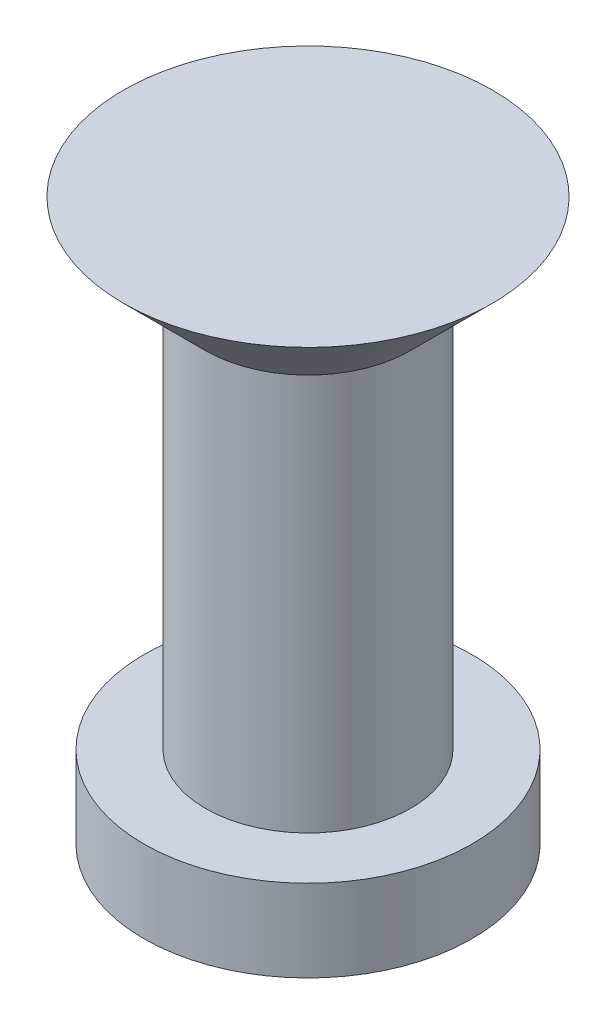
ISO-10303-21;
HEADER;
FILE_DESCRIPTION(('STEP AP214'),'2;1');
FILE_NAME('part.step','',(''),(''),'','','');
FILE_SCHEMA(('AUTOMOTIVE_DESIGN { 1 0 10303 214 1 1 1 1 }'));
ENDSEC;
DATA;
#1=APPLICATION_CONTEXT('core data for automotive mechanical design processes');
#2=APPLICATION_PROTOCOL_DEFINITION('international standard','automotive_design',2000,#1);
#3=PRODUCT_CONTEXT('',#1,'mechanical');
#4=PRODUCT('Part','Part','',(#3));
#5=PRODUCT_RELATED_PRODUCT_CATEGORY('part','',(#4));
#6=PRODUCT_DEFINITION_FORMATION('','',#4);
#7=PRODUCT_DEFINITION_CONTEXT('part definition',#1,'design');
#8=PRODUCT_DEFINITION('design','',#6,#7);
#9=PRODUCT_DEFINITION_SHAPE('','',#8);
#10=(LENGTH_UNIT() NAMED_UNIT(*) SI_UNIT(.MILLI.,.METRE.));
#11=(NAMED_UNIT(*) PLANE_ANGLE_UNIT() SI_UNIT($,.RADIAN.));
#12=(NAMED_UNIT(*) SI_UNIT($,.STERADIAN.) SOLID_ANGLE_UNIT());
#13=UNCERTAINTY_MEASURE_WITH_UNIT(LENGTH_MEASURE(1.E-05),#10,'distance_accuracy_value','');
#14=(GEOMETRIC_REPRESENTATION_CONTEXT(3) GLOBAL_UNCERTAINTY_ASSIGNED_CONTEXT((#13)) GLOBAL_UNIT_ASSIGNED_CONTEXT((#10,
#11,#12)) REPRESENTATION_CONTEXT('',''));
#15=CARTESIAN_POINT('',(0.,0.,0.));
#16=DIRECTION('',(0.,0.,1.));
#17=DIRECTION('',(1.,0.,0.));
#18=AXIS2_PLACEMENT_3D('',#15,#16,#17);
#19=CARTESIAN_POINT('',(0.,8.2,0.));
#20=DIRECTION('',(0.,-1.,0.));
#21=DIRECTION('',(0.,0.,-1.));
#22=AXIS2_PLACEMENT_3D('',#19,#20,#21);
#23=PLANE('',#22);
#24=CARTESIAN_POINT('',(0.,8.2,0.));
#25=DIRECTION('',(0.,1.,0.));
#26=DIRECTION('',(0.,0.,1.));
#27=AXIS2_PLACEMENT_3D('',#24,#25,#26);
#28=CIRCLE('',#27,2.70000000000001);
#29=CARTESIAN_POINT('',(0.,8.2,2.70000000000001));
#30=VERTEX_POINT('',#29);
#31=EDGE_CURVE('E10',#30,#30,#28,.T.);
#32=ORIENTED_EDGE('',*,*,#31,.T.);
#33=EDGE_LOOP('',(#32));
#34=FACE_BOUND('',#33,.T.);
#35=ADVANCED_FACE('F32',(#34),#23,.F.);
#36=CARTESIAN_POINT('',(0.,7.,0.));
#37=DIRECTION('',(0.,1.,0.));
#38=DIRECTION('',(0.,0.,1.));
#39=AXIS2_PLACEMENT_3D('',#36,#37,#38);
#40=CONICAL_SURFACE('',#39,1.5,0.78539816339745);
#41=ORIENTED_EDGE('',*,*,#31,.F.);
#42=EDGE_LOOP('',(#41));
#43=FACE_BOUND('',#42,.T.);
#44=CARTESIAN_POINT('',(0.,7.,0.));
#45=DIRECTION('',(0.,1.,0.));
#46=DIRECTION('',(0.,0.,1.));
#47=AXIS2_PLACEMENT_3D('',#44,#45,#46);
#48=CIRCLE('',#47,1.5);
#49=CARTESIAN_POINT('',(0.,7.,1.5));
#50=VERTEX_POINT('',#49);
#51=EDGE_CURVE('E38',#50,#50,#48,.T.);
#52=ORIENTED_EDGE('',*,*,#51,.T.);
#53=EDGE_LOOP('',(#52));
#54=FACE_BOUND('',#53,.T.);
#55=ADVANCED_FACE('F67',(#43,#54),#40,.T.);
#56=CARTESIAN_POINT('',(0.,26.718072965347,0.));
#57=DIRECTION('',(0.,1.,0.));
#58=DIRECTION('',(0.,0.,1.));
#59=AXIS2_PLACEMENT_3D('',#56,#57,#58);
#60=CYLINDRICAL_SURFACE('',#59,1.5);
#61=ORIENTED_EDGE('',*,*,#51,.F.);
#62=EDGE_LOOP('',(#61));
#63=FACE_BOUND('',#62,.T.);
#64=CARTESIAN_POINT('',(0.,1.2,0.));
#65=DIRECTION('',(0.,1.,0.));
#66=DIRECTION('',(0.,0.,1.));
#67=AXIS2_PLACEMENT_3D('',#64,#65,#66);
#68=CIRCLE('',#67,1.5);
#69=CARTESIAN_POINT('',(0.,1.2,1.5));
#70=VERTEX_POINT('',#69);
#71=EDGE_CURVE('E42',#70,#70,#68,.T.);
#72=ORIENTED_EDGE('',*,*,#71,.T.);
#73=EDGE_LOOP('',(#72));
#74=FACE_BOUND('',#73,.T.);
#75=ADVANCED_FACE('F71',(#63,#74),#60,.T.);
#76=CARTESIAN_POINT('',(1.5,1.2,0.));
#77=DIRECTION('',(0.,-1.,0.));
#78=DIRECTION('',(0.,0.,-1.));
#79=AXIS2_PLACEMENT_3D('',#76,#77,#78);
#80=PLANE('',#79);
#81=ORIENTED_EDGE('',*,*,#71,.F.);
#82=EDGE_LOOP('',(#81));
#83=FACE_BOUND('',#82,.T.);
#84=CARTESIAN_POINT('',(0.,1.2,0.));
#85=DIRECTION('',(0.,1.,0.));
#86=DIRECTION('',(0.,0.,1.));
#87=AXIS2_PLACEMENT_3D('',#84,#85,#86);
#88=CIRCLE('',#87,2.4);
#89=CARTESIAN_POINT('',(0.,1.2,2.4));
#90=VERTEX_POINT('',#89);
#91=EDGE_CURVE('E46',#90,#90,#88,.T.);
#92=ORIENTED_EDGE('',*,*,#91,.T.);
#93=EDGE_LOOP('',(#92));
#94=FACE_BOUND('',#93,.T.);
#95=ADVANCED_FACE('F63',(#83,#94),#80,.F.);
#96=CARTESIAN_POINT('',(0.,26.718072965347,0.));
#97=DIRECTION('',(0.,1.,0.));
#98=DIRECTION('',(0.,0.,1.));
#99=AXIS2_PLACEMENT_3D('',#96,#97,#98);
#100=CYLINDRICAL_SURFACE('',#99,2.4);
#101=ORIENTED_EDGE('',*,*,#91,.F.);
#102=EDGE_LOOP('',(#101));
#103=FACE_BOUND('',#102,.T.);
#104=CARTESIAN_POINT('',(0.,0.,0.));
#105=DIRECTION('',(0.,1.,0.));
#106=DIRECTION('',(0.,0.,1.));
#107=AXIS2_PLACEMENT_3D('',#104,#105,#106);
#108=CIRCLE('',#107,2.4);
#109=CARTESIAN_POINT('',(0.,0.,2.4));
#110=VERTEX_POINT('',#109);
#111=EDGE_CURVE('E51',#110,#110,#108,.T.);
#112=ORIENTED_EDGE('',*,*,#111,.T.);
#113=EDGE_LOOP('',(#112));
#114=FACE_BOUND('',#113,.T.);
#115=ADVANCED_FACE('F55',(#103,#114),#100,.T.);
#116=CARTESIAN_POINT('',(2.4,0.,0.));
#117=DIRECTION('',(0.,1.,0.));
#118=DIRECTION('',(0.,0.,1.));
#119=AXIS2_PLACEMENT_3D('',#116,#117,#118);
#120=PLANE('',#119);
#121=ORIENTED_EDGE('',*,*,#111,.F.);
#122=EDGE_LOOP('',(#121));
#123=FACE_BOUND('',#122,.T.);
#124=ADVANCED_FACE('F57',(#123),#120,.F.);
#125=CLOSED_SHELL('',(#35,#55,#75,#95,#115,#124));
#126=MANIFOLD_SOLID_BREP('B2',#125);
#127=ADVANCED_BREP_SHAPE_REPRESENTATION('',(#18,#126),#14);
#128=SHAPE_DEFINITION_REPRESENTATION(#9,#127);
ENDSEC;
END-ISO-10303-21;
